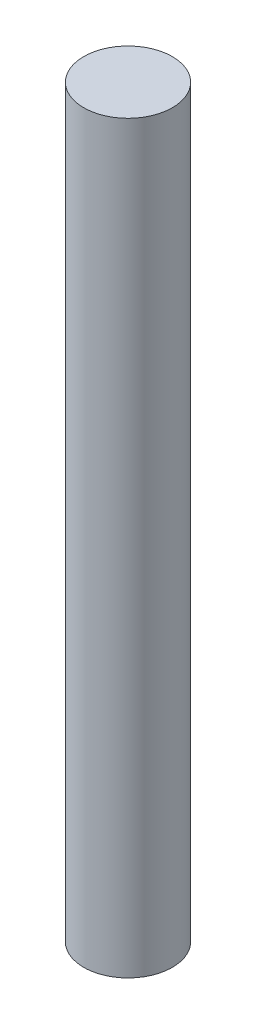
ISO-10303-21;
HEADER;
FILE_DESCRIPTION(('STEP AP214'),'2;1');
FILE_NAME('part.step','',(''),(''),'','','');
FILE_SCHEMA(('AUTOMOTIVE_DESIGN { 1 0 10303 214 1 1 1 1 }'));
ENDSEC;
DATA;
#1=APPLICATION_CONTEXT('core data for automotive mechanical design processes');
#2=APPLICATION_PROTOCOL_DEFINITION('international standard','automotive_design',2000,#1);
#3=PRODUCT_CONTEXT('',#1,'mechanical');
#4=PRODUCT('Part','Part','',(#3));
#5=PRODUCT_RELATED_PRODUCT_CATEGORY('part','',(#4));
#6=PRODUCT_DEFINITION_FORMATION('','',#4);
#7=PRODUCT_DEFINITION_CONTEXT('part definition',#1,'design');
#8=PRODUCT_DEFINITION('design','',#6,#7);
#9=PRODUCT_DEFINITION_SHAPE('','',#8);
#10=(LENGTH_UNIT() NAMED_UNIT(*) SI_UNIT(.MILLI.,.METRE.));
#11=(NAMED_UNIT(*) PLANE_ANGLE_UNIT() SI_UNIT($,.RADIAN.));
#12=(NAMED_UNIT(*) SI_UNIT($,.STERADIAN.) SOLID_ANGLE_UNIT());
#13=UNCERTAINTY_MEASURE_WITH_UNIT(LENGTH_MEASURE(1.E-05),#10,'distance_accuracy_value','');
#14=(GEOMETRIC_REPRESENTATION_CONTEXT(3) GLOBAL_UNCERTAINTY_ASSIGNED_CONTEXT((#13)) GLOBAL_UNIT_ASSIGNED_CONTEXT((#10,
#11,#12)) REPRESENTATION_CONTEXT('',''));
#15=CARTESIAN_POINT('',(0.,0.,0.));
#16=DIRECTION('',(0.,0.,1.));
#17=DIRECTION('',(1.,0.,0.));
#18=AXIS2_PLACEMENT_3D('',#15,#16,#17);
#19=CARTESIAN_POINT('',(0.,84.,0.));
#20=DIRECTION('',(0.,-1.,0.));
#21=DIRECTION('',(0.,0.,-1.));
#22=AXIS2_PLACEMENT_3D('',#19,#20,#21);
#23=CYLINDRICAL_SURFACE('',#22,5.);
#24=CARTESIAN_POINT('',(0.,84.,0.));
#25=DIRECTION('',(0.,1.,0.));
#26=DIRECTION('',(0.,0.,1.));
#27=AXIS2_PLACEMENT_3D('',#24,#25,#26);
#28=CIRCLE('',#27,5.);
#29=CARTESIAN_POINT('',(0.,84.,-5.));
#30=VERTEX_POINT('',#29);
#31=EDGE_CURVE('E10',#30,#30,#28,.T.);
#32=CARTESIAN_POINT('',(0.,0.,0.));
#33=DIRECTION('',(0.,1.,0.));
#34=DIRECTION('',(0.,0.,1.));
#35=AXIS2_PLACEMENT_3D('',#32,#33,#34);
#36=CIRCLE('',#35,5.);
#37=CARTESIAN_POINT('',(0.,0.,-5.));
#38=VERTEX_POINT('',#37);
#39=EDGE_CURVE('E36',#38,#38,#36,.T.);
#40=CARTESIAN_POINT('',(0.,84.,-5.));
#41=CARTESIAN_POINT('',(0.,83.125,-5.));
#42=CARTESIAN_POINT('',(0.,82.25,-5.));
#43=CARTESIAN_POINT('',(0.,80.5,-5.));
#44=CARTESIAN_POINT('',(0.,79.625,-5.));
#45=CARTESIAN_POINT('',(0.,77.875,-5.));
#46=CARTESIAN_POINT('',(0.,77.,-5.));
#47=CARTESIAN_POINT('',(0.,75.25,-5.));
#48=CARTESIAN_POINT('',(0.,74.375,-5.));
#49=CARTESIAN_POINT('',(0.,72.625,-5.));
#50=CARTESIAN_POINT('',(0.,71.75,-5.));
#51=CARTESIAN_POINT('',(0.,70.,-5.));
#52=CARTESIAN_POINT('',(0.,69.125,-5.));
#53=CARTESIAN_POINT('',(0.,67.375,-5.));
#54=CARTESIAN_POINT('',(0.,66.5,-5.));
#55=CARTESIAN_POINT('',(0.,64.75,-5.));
#56=CARTESIAN_POINT('',(0.,63.875,-5.));
#57=CARTESIAN_POINT('',(0.,62.125,-5.));
#58=CARTESIAN_POINT('',(0.,61.25,-5.));
#59=CARTESIAN_POINT('',(0.,59.5,-5.));
#60=CARTESIAN_POINT('',(0.,58.625,-5.));
#61=CARTESIAN_POINT('',(0.,56.875,-5.));
#62=CARTESIAN_POINT('',(0.,56.,-5.));
#63=CARTESIAN_POINT('',(0.,54.25,-5.));
#64=CARTESIAN_POINT('',(0.,53.375,-5.));
#65=CARTESIAN_POINT('',(0.,51.625,-5.));
#66=CARTESIAN_POINT('',(0.,50.75,-5.));
#67=CARTESIAN_POINT('',(0.,49.,-5.));
#68=CARTESIAN_POINT('',(0.,48.125,-5.));
#69=CARTESIAN_POINT('',(0.,46.375,-5.));
#70=CARTESIAN_POINT('',(0.,45.5,-5.));
#71=CARTESIAN_POINT('',(0.,43.75,-5.));
#72=CARTESIAN_POINT('',(0.,42.875,-5.));
#73=CARTESIAN_POINT('',(0.,41.125,-5.));
#74=CARTESIAN_POINT('',(0.,40.25,-5.));
#75=CARTESIAN_POINT('',(0.,38.5,-5.));
#76=CARTESIAN_POINT('',(0.,37.625,-5.));
#77=CARTESIAN_POINT('',(0.,35.875,-5.));
#78=CARTESIAN_POINT('',(0.,35.,-5.));
#79=CARTESIAN_POINT('',(0.,33.25,-5.));
#80=CARTESIAN_POINT('',(0.,32.375,-5.));
#81=CARTESIAN_POINT('',(0.,30.625,-5.));
#82=CARTESIAN_POINT('',(0.,29.75,-5.));
#83=CARTESIAN_POINT('',(0.,28.,-5.));
#84=CARTESIAN_POINT('',(0.,27.125,-5.));
#85=CARTESIAN_POINT('',(0.,25.375,-5.));
#86=CARTESIAN_POINT('',(0.,24.5,-5.));
#87=CARTESIAN_POINT('',(0.,22.75,-5.));
#88=CARTESIAN_POINT('',(0.,21.875,-5.));
#89=CARTESIAN_POINT('',(0.,20.125,-5.));
#90=CARTESIAN_POINT('',(0.,19.25,-5.));
#91=CARTESIAN_POINT('',(0.,17.5,-5.));
#92=CARTESIAN_POINT('',(0.,16.625,-5.));
#93=CARTESIAN_POINT('',(0.,14.875,-5.));
#94=CARTESIAN_POINT('',(0.,14.,-5.));
#95=CARTESIAN_POINT('',(0.,12.25,-5.));
#96=CARTESIAN_POINT('',(0.,11.375,-5.));
#97=CARTESIAN_POINT('',(0.,9.62500000000001,-5.));
#98=CARTESIAN_POINT('',(0.,8.75000000000001,-5.));
#99=CARTESIAN_POINT('',(0.,7.00000000000001,-5.));
#100=CARTESIAN_POINT('',(0.,6.12500000000001,-5.));
#101=CARTESIAN_POINT('',(0.,4.375,-5.));
#102=CARTESIAN_POINT('',(0.,3.5,-5.));
#103=CARTESIAN_POINT('',(0.,1.75,-5.));
#104=CARTESIAN_POINT('',(0.,0.875,-5.));
#105=CARTESIAN_POINT('',(0.,0.,-5.));
#106=B_SPLINE_CURVE_WITH_KNOTS('',3,(#40,#41,#42,#43,#44,#45,#46,#47,#48,#49,#50,#51,#52,#53,
#54,#55,#56,#57,#58,#59,#60,#61,#62,#63,#64,#65,#66,#67,#68,#69,#70,#71,#72,#73,#74,#75,#76,#77,
#78,#79,#80,#81,#82,#83,#84,#85,#86,#87,#88,#89,#90,#91,#92,#93,#94,#95,#96,#97,#98,#99,#100,
#101,#102,#103,#104,#105),.UNSPECIFIED.,.F.,.F.,(4,2,2,2,2,2,2,2,2,2,2,2,2,2,2,2,2,2,2,2,2,2,2,
2,2,2,2,2,2,2,2,2,4),(0.,2.625,5.25,7.87500000000001,10.5,13.125,15.75,18.375,21.,23.625,26.25,
28.875,31.5,34.125,36.75,39.375,42.,44.625,47.25,49.875,52.5,55.125,57.75,60.375,63.,65.625,
68.25,70.875,73.5,76.125,78.75,81.375,84.),.UNSPECIFIED.);
#107=EDGE_CURVE('BSEAM33',#30,#38,#106,.T.);
#108=ORIENTED_EDGE('',*,*,#31,.F.);
#109=ORIENTED_EDGE('',*,*,#39,.T.);
#110=ORIENTED_EDGE('',*,*,#107,.T.);
#111=ORIENTED_EDGE('',*,*,#107,.F.);
#112=EDGE_LOOP('',(#108,#110,#109,#111));
#113=FACE_BOUND('',#112,.T.);
#114=ADVANCED_FACE('F33',(#113),#23,.T.);
#115=CARTESIAN_POINT('',(0.,84.,0.));
#116=DIRECTION('',(0.,1.,0.));
#117=DIRECTION('',(0.,0.,1.));
#118=AXIS2_PLACEMENT_3D('',#115,#116,#117);
#119=PLANE('',#118);
#120=ORIENTED_EDGE('',*,*,#31,.T.);
#121=EDGE_LOOP('',(#120));
#122=FACE_BOUND('',#121,.T.);
#123=ADVANCED_FACE('F48',(#122),#119,.T.);
#124=CARTESIAN_POINT('',(0.,0.,0.));
#125=DIRECTION('',(0.,1.,0.));
#126=DIRECTION('',(0.,0.,1.));
#127=AXIS2_PLACEMENT_3D('',#124,#125,#126);
#128=PLANE('',#127);
#129=ORIENTED_EDGE('',*,*,#39,.F.);
#130=EDGE_LOOP('',(#129));
#131=FACE_BOUND('',#130,.T.);
#132=ADVANCED_FACE('F46',(#131),#128,.F.);
#133=CLOSED_SHELL('',(#114,#123,#132));
#134=MANIFOLD_SOLID_BREP('B2',#133);
#135=ADVANCED_BREP_SHAPE_REPRESENTATION('',(#18,#134),#14);
#136=SHAPE_DEFINITION_REPRESENTATION(#9,#135);
ENDSEC;
END-ISO-10303-21;
